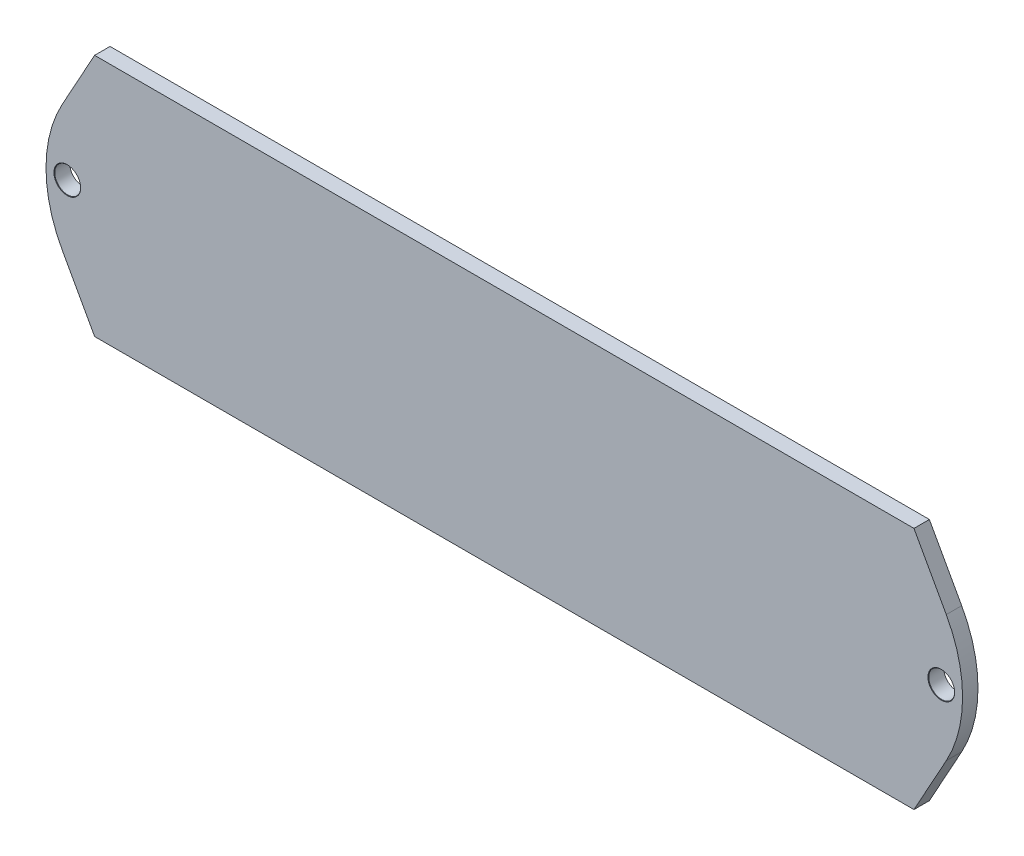
ISO-10303-21;
HEADER;
FILE_DESCRIPTION(('STEP AP214'),'2;1');
FILE_NAME('part.step','',(''),(''),'','','');
FILE_SCHEMA(('AUTOMOTIVE_DESIGN { 1 0 10303 214 1 1 1 1 }'));
ENDSEC;
DATA;
#1=APPLICATION_CONTEXT('core data for automotive mechanical design processes');
#2=APPLICATION_PROTOCOL_DEFINITION('international standard','automotive_design',2000,#1);
#3=PRODUCT_CONTEXT('',#1,'mechanical');
#4=PRODUCT('Part','Part','',(#3));
#5=PRODUCT_RELATED_PRODUCT_CATEGORY('part','',(#4));
#6=PRODUCT_DEFINITION_FORMATION('','',#4);
#7=PRODUCT_DEFINITION_CONTEXT('part definition',#1,'design');
#8=PRODUCT_DEFINITION('design','',#6,#7);
#9=PRODUCT_DEFINITION_SHAPE('','',#8);
#10=(LENGTH_UNIT() NAMED_UNIT(*) SI_UNIT(.MILLI.,.METRE.));
#11=(NAMED_UNIT(*) PLANE_ANGLE_UNIT() SI_UNIT($,.RADIAN.));
#12=(NAMED_UNIT(*) SI_UNIT($,.STERADIAN.) SOLID_ANGLE_UNIT());
#13=UNCERTAINTY_MEASURE_WITH_UNIT(LENGTH_MEASURE(1.E-05),#10,'distance_accuracy_value','');
#14=(GEOMETRIC_REPRESENTATION_CONTEXT(3) GLOBAL_UNCERTAINTY_ASSIGNED_CONTEXT((#13)) GLOBAL_UNIT_ASSIGNED_CONTEXT((#10,
#11,#12)) REPRESENTATION_CONTEXT('',''));
#15=CARTESIAN_POINT('',(0.,0.,0.));
#16=DIRECTION('',(0.,0.,1.));
#17=DIRECTION('',(1.,0.,0.));
#18=AXIS2_PLACEMENT_3D('',#15,#16,#17);
#19=CARTESIAN_POINT('',(-54.5903175982306,7.81349389640808,1.905));
#20=DIRECTION('',(0.875409582506593,-0.483381901663304,0.));
#21=DIRECTION('',(0.483381901663304,0.875409582506593,0.));
#22=AXIS2_PLACEMENT_3D('',#19,#20,#21);
#23=PLANE('',#22);
#24=DIRECTION('',(-0.483381901663304,-0.875409582506593,0.));
#25=VECTOR('',#24,1.);
#26=CARTESIAN_POINT('',(-54.5903175982306,7.81349389640808,0.));
#27=LINE('',#26,#25);
#28=CARTESIAN_POINT('',(-50.6,15.04,0.));
#29=VERTEX_POINT('',#28);
#30=CARTESIAN_POINT('',(-54.5903175982306,7.81349389640807,0.));
#31=VERTEX_POINT('',#30);
#32=EDGE_CURVE('E135',#29,#31,#27,.T.);
#33=ORIENTED_EDGE('',*,*,#32,.T.);
#34=DIRECTION('',(0.,0.,-1.));
#35=VECTOR('',#34,1.);
#36=CARTESIAN_POINT('',(-54.5903175982306,7.81349389640807,1.905));
#37=LINE('',#36,#35);
#38=CARTESIAN_POINT('',(-54.5903175982306,7.81349389640807,1.905));
#39=VERTEX_POINT('',#38);
#40=EDGE_CURVE('E11',#39,#31,#37,.T.);
#41=ORIENTED_EDGE('',*,*,#40,.F.);
#42=DIRECTION('',(-0.483381901663304,-0.875409582506593,0.));
#43=VECTOR('',#42,1.);
#44=CARTESIAN_POINT('',(-54.5903175982306,7.81349389640808,1.905));
#45=LINE('',#44,#43);
#46=CARTESIAN_POINT('',(-50.6,15.04,1.905));
#47=VERTEX_POINT('',#46);
#48=EDGE_CURVE('E150',#47,#39,#45,.T.);
#49=ORIENTED_EDGE('',*,*,#48,.F.);
#50=DIRECTION('',(0.,0.,-1.));
#51=VECTOR('',#50,1.);
#52=CARTESIAN_POINT('',(-50.6,15.04,1.905));
#53=LINE('',#52,#51);
#54=EDGE_CURVE('E131',#47,#29,#53,.T.);
#55=ORIENTED_EDGE('',*,*,#54,.T.);
#56=EDGE_LOOP('',(#33,#41,#49,#55));
#57=FACE_BOUND('',#56,.T.);
#58=ADVANCED_FACE('F39',(#57),#23,.F.);
#59=CARTESIAN_POINT('',(-40.44,0.,1.905));
#60=DIRECTION('',(0.,0.,-1.));
#61=DIRECTION('',(-1.,0.,0.));
#62=AXIS2_PLACEMENT_3D('',#59,#60,#61);
#63=CYLINDRICAL_SURFACE('',#62,16.1642251592831);
#64=CARTESIAN_POINT('',(-40.44,0.,0.));
#65=DIRECTION('',(0.,0.,1.));
#66=DIRECTION('',(-1.,0.,0.));
#67=AXIS2_PLACEMENT_3D('',#64,#65,#66);
#68=CIRCLE('',#67,16.1642251592831);
#69=CARTESIAN_POINT('',(-54.5903175982306,-7.81349389640805,0.));
#70=VERTEX_POINT('',#69);
#71=EDGE_CURVE('E138',#31,#70,#68,.T.);
#72=ORIENTED_EDGE('',*,*,#71,.T.);
#73=DIRECTION('',(0.,0.,-1.));
#74=VECTOR('',#73,1.);
#75=CARTESIAN_POINT('',(-54.5903175982306,-7.81349389640805,1.905));
#76=LINE('',#75,#74);
#77=CARTESIAN_POINT('',(-54.5903175982306,-7.81349389640805,1.905));
#78=VERTEX_POINT('',#77);
#79=EDGE_CURVE('E47',#78,#70,#76,.T.);
#80=ORIENTED_EDGE('',*,*,#79,.F.);
#81=CARTESIAN_POINT('',(-40.44,0.,1.905));
#82=DIRECTION('',(0.,0.,1.));
#83=DIRECTION('',(-1.,0.,0.));
#84=AXIS2_PLACEMENT_3D('',#81,#82,#83);
#85=CIRCLE('',#84,16.1642251592831);
#86=EDGE_CURVE('E98',#39,#78,#85,.T.);
#87=ORIENTED_EDGE('',*,*,#86,.F.);
#88=ORIENTED_EDGE('',*,*,#40,.T.);
#89=EDGE_LOOP('',(#72,#80,#87,#88));
#90=FACE_BOUND('',#89,.T.);
#91=ADVANCED_FACE('F225',(#90),#63,.T.);
#92=CARTESIAN_POINT('',(-50.6,-15.04,1.905));
#93=DIRECTION('',(0.875409582506593,0.483381901663304,0.));
#94=DIRECTION('',(-0.483381901663304,0.875409582506593,0.));
#95=AXIS2_PLACEMENT_3D('',#92,#93,#94);
#96=PLANE('',#95);
#97=DIRECTION('',(0.483381901663304,-0.875409582506593,0.));
#98=VECTOR('',#97,1.);
#99=CARTESIAN_POINT('',(-50.6,-15.04,0.));
#100=LINE('',#99,#98);
#101=CARTESIAN_POINT('',(-50.6,-15.04,0.));
#102=VERTEX_POINT('',#101);
#103=EDGE_CURVE('E141',#70,#102,#100,.T.);
#104=ORIENTED_EDGE('',*,*,#103,.T.);
#105=DIRECTION('',(0.,0.,-1.));
#106=VECTOR('',#105,1.);
#107=CARTESIAN_POINT('',(-50.6,-15.04,1.905));
#108=LINE('',#107,#106);
#109=CARTESIAN_POINT('',(-50.6,-15.04,1.905));
#110=VERTEX_POINT('',#109);
#111=EDGE_CURVE('E157',#110,#102,#108,.T.);
#112=ORIENTED_EDGE('',*,*,#111,.F.);
#113=DIRECTION('',(0.483381901663304,-0.875409582506593,0.));
#114=VECTOR('',#113,1.);
#115=CARTESIAN_POINT('',(-50.6,-15.04,1.905));
#116=LINE('',#115,#114);
#117=EDGE_CURVE('E165',#78,#110,#116,.T.);
#118=ORIENTED_EDGE('',*,*,#117,.F.);
#119=ORIENTED_EDGE('',*,*,#79,.T.);
#120=EDGE_LOOP('',(#104,#112,#118,#119));
#121=FACE_BOUND('',#120,.T.);
#122=ADVANCED_FACE('F163',(#121),#96,.F.);
#123=CARTESIAN_POINT('',(50.6,-15.04,1.905));
#124=DIRECTION('',(0.,1.,0.));
#125=DIRECTION('',(-1.,0.,0.));
#126=AXIS2_PLACEMENT_3D('',#123,#124,#125);
#127=PLANE('',#126);
#128=DIRECTION('',(1.,0.,0.));
#129=VECTOR('',#128,1.);
#130=CARTESIAN_POINT('',(50.6,-15.04,0.));
#131=LINE('',#130,#129);
#132=CARTESIAN_POINT('',(50.6,-15.04,0.));
#133=VERTEX_POINT('',#132);
#134=EDGE_CURVE('E143',#102,#133,#131,.T.);
#135=ORIENTED_EDGE('',*,*,#134,.T.);
#136=DIRECTION('',(0.,0.,-1.));
#137=VECTOR('',#136,1.);
#138=CARTESIAN_POINT('',(50.6,-15.04,1.905));
#139=LINE('',#138,#137);
#140=CARTESIAN_POINT('',(50.6,-15.04,1.905));
#141=VERTEX_POINT('',#140);
#142=EDGE_CURVE('E154',#141,#133,#139,.T.);
#143=ORIENTED_EDGE('',*,*,#142,.F.);
#144=DIRECTION('',(1.,0.,0.));
#145=VECTOR('',#144,1.);
#146=CARTESIAN_POINT('',(50.6,-15.04,1.905));
#147=LINE('',#146,#145);
#148=EDGE_CURVE('E177',#110,#141,#147,.T.);
#149=ORIENTED_EDGE('',*,*,#148,.F.);
#150=ORIENTED_EDGE('',*,*,#111,.T.);
#151=EDGE_LOOP('',(#135,#143,#149,#150));
#152=FACE_BOUND('',#151,.T.);
#153=ADVANCED_FACE('F173',(#152),#127,.F.);
#154=CARTESIAN_POINT('',(54.5903175982306,-7.81349389640805,1.905));
#155=DIRECTION('',(-0.875409582506594,0.483381901663302,0.));
#156=DIRECTION('',(-0.483381901663302,-0.875409582506594,0.));
#157=AXIS2_PLACEMENT_3D('',#154,#155,#156);
#158=PLANE('',#157);
#159=DIRECTION('',(0.483381901663302,0.875409582506594,0.));
#160=VECTOR('',#159,1.);
#161=CARTESIAN_POINT('',(54.5903175982306,-7.81349389640805,0.));
#162=LINE('',#161,#160);
#163=CARTESIAN_POINT('',(54.5903175982306,-7.81349389640805,0.));
#164=VERTEX_POINT('',#163);
#165=EDGE_CURVE('E145',#133,#164,#162,.T.);
#166=ORIENTED_EDGE('',*,*,#165,.T.);
#167=DIRECTION('',(0.,0.,-1.));
#168=VECTOR('',#167,1.);
#169=CARTESIAN_POINT('',(54.5903175982306,-7.81349389640805,1.905));
#170=LINE('',#169,#168);
#171=CARTESIAN_POINT('',(54.5903175982306,-7.81349389640805,1.905));
#172=VERTEX_POINT('',#171);
#173=EDGE_CURVE('E126',#172,#164,#170,.T.);
#174=ORIENTED_EDGE('',*,*,#173,.F.);
#175=DIRECTION('',(0.483381901663302,0.875409582506594,0.));
#176=VECTOR('',#175,1.);
#177=CARTESIAN_POINT('',(54.5903175982306,-7.81349389640805,1.905));
#178=LINE('',#177,#176);
#179=EDGE_CURVE('E117',#141,#172,#178,.T.);
#180=ORIENTED_EDGE('',*,*,#179,.F.);
#181=ORIENTED_EDGE('',*,*,#142,.T.);
#182=EDGE_LOOP('',(#166,#174,#180,#181));
#183=FACE_BOUND('',#182,.T.);
#184=ADVANCED_FACE('F176',(#183),#158,.F.);
#185=CARTESIAN_POINT('',(40.44,0.,1.905));
#186=DIRECTION('',(0.,0.,-1.));
#187=DIRECTION('',(-1.,0.,0.));
#188=AXIS2_PLACEMENT_3D('',#185,#186,#187);
#189=CYLINDRICAL_SURFACE('',#188,16.1642251592831);
#190=CARTESIAN_POINT('',(40.44,0.,0.));
#191=DIRECTION('',(0.,0.,1.));
#192=DIRECTION('',(-1.,0.,0.));
#193=AXIS2_PLACEMENT_3D('',#190,#191,#192);
#194=CIRCLE('',#193,16.1642251592831);
#195=CARTESIAN_POINT('',(54.5903175982306,7.81349389640807,0.));
#196=VERTEX_POINT('',#195);
#197=EDGE_CURVE('E125',#164,#196,#194,.T.);
#198=ORIENTED_EDGE('',*,*,#197,.T.);
#199=DIRECTION('',(0.,0.,-1.));
#200=VECTOR('',#199,1.);
#201=CARTESIAN_POINT('',(54.5903175982306,7.81349389640807,1.905));
#202=LINE('',#201,#200);
#203=CARTESIAN_POINT('',(54.5903175982306,7.81349389640807,1.905));
#204=VERTEX_POINT('',#203);
#205=EDGE_CURVE('E122',#204,#196,#202,.T.);
#206=ORIENTED_EDGE('',*,*,#205,.F.);
#207=CARTESIAN_POINT('',(40.44,0.,1.905));
#208=DIRECTION('',(0.,0.,1.));
#209=DIRECTION('',(-1.,0.,0.));
#210=AXIS2_PLACEMENT_3D('',#207,#208,#209);
#211=CIRCLE('',#210,16.1642251592831);
#212=EDGE_CURVE('E111',#172,#204,#211,.T.);
#213=ORIENTED_EDGE('',*,*,#212,.F.);
#214=ORIENTED_EDGE('',*,*,#173,.T.);
#215=EDGE_LOOP('',(#198,#206,#213,#214));
#216=FACE_BOUND('',#215,.T.);
#217=ADVANCED_FACE('F123',(#216),#189,.T.);
#218=CARTESIAN_POINT('',(50.6,15.04,1.905));
#219=DIRECTION('',(-0.875409582506594,-0.483381901663303,0.));
#220=DIRECTION('',(0.483381901663303,-0.875409582506594,0.));
#221=AXIS2_PLACEMENT_3D('',#218,#219,#220);
#222=PLANE('',#221);
#223=DIRECTION('',(-0.483381901663303,0.875409582506594,0.));
#224=VECTOR('',#223,1.);
#225=CARTESIAN_POINT('',(50.6,15.04,0.));
#226=LINE('',#225,#224);
#227=CARTESIAN_POINT('',(50.6,15.04,0.));
#228=VERTEX_POINT('',#227);
#229=EDGE_CURVE('E84',#196,#228,#226,.T.);
#230=ORIENTED_EDGE('',*,*,#229,.T.);
#231=DIRECTION('',(0.,0.,-1.));
#232=VECTOR('',#231,1.);
#233=CARTESIAN_POINT('',(50.6,15.04,1.905));
#234=LINE('',#233,#232);
#235=CARTESIAN_POINT('',(50.6,15.04,1.905));
#236=VERTEX_POINT('',#235);
#237=EDGE_CURVE('E127',#236,#228,#234,.T.);
#238=ORIENTED_EDGE('',*,*,#237,.F.);
#239=DIRECTION('',(-0.483381901663303,0.875409582506594,0.));
#240=VECTOR('',#239,1.);
#241=CARTESIAN_POINT('',(50.6,15.04,1.905));
#242=LINE('',#241,#240);
#243=EDGE_CURVE('E115',#204,#236,#242,.T.);
#244=ORIENTED_EDGE('',*,*,#243,.F.);
#245=ORIENTED_EDGE('',*,*,#205,.T.);
#246=EDGE_LOOP('',(#230,#238,#244,#245));
#247=FACE_BOUND('',#246,.T.);
#248=ADVANCED_FACE('F129',(#247),#222,.F.);
#249=CARTESIAN_POINT('',(-50.6,15.04,1.905));
#250=DIRECTION('',(0.,-1.,0.));
#251=DIRECTION('',(0.,0.,-1.));
#252=AXIS2_PLACEMENT_3D('',#249,#250,#251);
#253=PLANE('',#252);
#254=DIRECTION('',(-1.,0.,0.));
#255=VECTOR('',#254,1.);
#256=CARTESIAN_POINT('',(-50.6,15.04,0.));
#257=LINE('',#256,#255);
#258=EDGE_CURVE('E90',#228,#29,#257,.T.);
#259=ORIENTED_EDGE('',*,*,#258,.T.);
#260=ORIENTED_EDGE('',*,*,#54,.F.);
#261=DIRECTION('',(-1.,0.,0.));
#262=VECTOR('',#261,1.);
#263=CARTESIAN_POINT('',(-50.6,15.04,1.905));
#264=LINE('',#263,#262);
#265=EDGE_CURVE('E55',#236,#47,#264,.T.);
#266=ORIENTED_EDGE('',*,*,#265,.F.);
#267=ORIENTED_EDGE('',*,*,#237,.T.);
#268=EDGE_LOOP('',(#259,#260,#266,#267));
#269=FACE_BOUND('',#268,.T.);
#270=ADVANCED_FACE('F205',(#269),#253,.F.);
#271=CARTESIAN_POINT('',(40.44,0.,1.905));
#272=DIRECTION('',(0.,0.,-1.));
#273=DIRECTION('',(-1.,0.,0.));
#274=AXIS2_PLACEMENT_3D('',#271,#272,#273);
#275=PLANE('',#274);
#276=CARTESIAN_POINT('',(-53.975,0.,1.905));
#277=DIRECTION('',(0.,0.,1.));
#278=DIRECTION('',(1.,0.,0.));
#279=AXIS2_PLACEMENT_3D('',#276,#277,#278);
#280=CIRCLE('',#279,1.65);
#281=CARTESIAN_POINT('',(-52.325,0.,1.905));
#282=VERTEX_POINT('',#281);
#283=EDGE_CURVE('E197',#282,#282,#280,.T.);
#284=ORIENTED_EDGE('',*,*,#283,.F.);
#285=EDGE_LOOP('',(#284));
#286=FACE_BOUND('',#285,.T.);
#287=CARTESIAN_POINT('',(53.975,0.,1.905));
#288=DIRECTION('',(0.,0.,1.));
#289=DIRECTION('',(1.,0.,0.));
#290=AXIS2_PLACEMENT_3D('',#287,#288,#289);
#291=CIRCLE('',#290,1.65);
#292=CARTESIAN_POINT('',(55.625,0.,1.905));
#293=VERTEX_POINT('',#292);
#294=EDGE_CURVE('E188',#293,#293,#291,.T.);
#295=ORIENTED_EDGE('',*,*,#294,.F.);
#296=EDGE_LOOP('',(#295));
#297=FACE_BOUND('',#296,.T.);
#298=ORIENTED_EDGE('',*,*,#48,.T.);
#299=ORIENTED_EDGE('',*,*,#86,.T.);
#300=ORIENTED_EDGE('',*,*,#117,.T.);
#301=ORIENTED_EDGE('',*,*,#148,.T.);
#302=ORIENTED_EDGE('',*,*,#179,.T.);
#303=ORIENTED_EDGE('',*,*,#212,.T.);
#304=ORIENTED_EDGE('',*,*,#243,.T.);
#305=ORIENTED_EDGE('',*,*,#265,.T.);
#306=EDGE_LOOP('',(#298,#299,#300,#301,#302,#303,#304,#305));
#307=FACE_BOUND('',#306,.T.);
#308=ADVANCED_FACE('F113',(#286,#297,#307),#275,.F.);
#309=CARTESIAN_POINT('',(40.44,0.,0.));
#310=DIRECTION('',(0.,0.,-1.));
#311=DIRECTION('',(-1.,0.,0.));
#312=AXIS2_PLACEMENT_3D('',#309,#310,#311);
#313=PLANE('',#312);
#314=CARTESIAN_POINT('',(-53.975,0.,0.));
#315=DIRECTION('',(0.,0.,1.));
#316=DIRECTION('',(1.,0.,0.));
#317=AXIS2_PLACEMENT_3D('',#314,#315,#316);
#318=CIRCLE('',#317,1.6);
#319=CARTESIAN_POINT('',(-52.375,0.,0.));
#320=VERTEX_POINT('',#319);
#321=EDGE_CURVE('E191',#320,#320,#318,.T.);
#322=ORIENTED_EDGE('',*,*,#321,.T.);
#323=EDGE_LOOP('',(#322));
#324=FACE_BOUND('',#323,.T.);
#325=CARTESIAN_POINT('',(53.975,0.,0.));
#326=DIRECTION('',(0.,0.,1.));
#327=DIRECTION('',(1.,0.,0.));
#328=AXIS2_PLACEMENT_3D('',#325,#326,#327);
#329=CIRCLE('',#328,1.6);
#330=CARTESIAN_POINT('',(55.575,0.,0.));
#331=VERTEX_POINT('',#330);
#332=EDGE_CURVE('E139',#331,#331,#329,.T.);
#333=ORIENTED_EDGE('',*,*,#332,.T.);
#334=EDGE_LOOP('',(#333));
#335=FACE_BOUND('',#334,.T.);
#336=ORIENTED_EDGE('',*,*,#32,.F.);
#337=ORIENTED_EDGE('',*,*,#258,.F.);
#338=ORIENTED_EDGE('',*,*,#229,.F.);
#339=ORIENTED_EDGE('',*,*,#197,.F.);
#340=ORIENTED_EDGE('',*,*,#165,.F.);
#341=ORIENTED_EDGE('',*,*,#134,.F.);
#342=ORIENTED_EDGE('',*,*,#103,.F.);
#343=ORIENTED_EDGE('',*,*,#71,.F.);
#344=EDGE_LOOP('',(#336,#337,#338,#339,#340,#341,#342,#343));
#345=FACE_BOUND('',#344,.T.);
#346=ADVANCED_FACE('F169',(#324,#335,#345),#313,.T.);
#347=CARTESIAN_POINT('',(53.975,0.,1.905));
#348=DIRECTION('',(0.,0.,1.));
#349=DIRECTION('',(1.,0.,0.));
#350=AXIS2_PLACEMENT_3D('',#347,#348,#349);
#351=CYLINDRICAL_SURFACE('',#350,1.6);
#352=ORIENTED_EDGE('',*,*,#332,.F.);
#353=EDGE_LOOP('',(#352));
#354=FACE_BOUND('',#353,.T.);
#355=CARTESIAN_POINT('',(53.975,0.,1.855));
#356=DIRECTION('',(0.,0.,1.));
#357=DIRECTION('',(1.,0.,0.));
#358=AXIS2_PLACEMENT_3D('',#355,#356,#357);
#359=CIRCLE('',#358,1.6);
#360=CARTESIAN_POINT('',(55.575,0.,1.855));
#361=VERTEX_POINT('',#360);
#362=EDGE_CURVE('E185',#361,#361,#359,.T.);
#363=ORIENTED_EDGE('',*,*,#362,.T.);
#364=EDGE_LOOP('',(#363));
#365=FACE_BOUND('',#364,.T.);
#366=ADVANCED_FACE('F212',(#354,#365),#351,.F.);
#367=CARTESIAN_POINT('',(53.975,0.,1.905));
#368=DIRECTION('',(0.,0.,1.));
#369=DIRECTION('',(1.,0.,0.));
#370=AXIS2_PLACEMENT_3D('',#367,#368,#369);
#371=CONICAL_SURFACE('',#370,1.65,0.785398163397463);
#372=ORIENTED_EDGE('',*,*,#362,.F.);
#373=EDGE_LOOP('',(#372));
#374=FACE_BOUND('',#373,.T.);
#375=ORIENTED_EDGE('',*,*,#294,.T.);
#376=EDGE_LOOP('',(#375));
#377=FACE_BOUND('',#376,.T.);
#378=ADVANCED_FACE('F209',(#374,#377),#371,.F.);
#379=CARTESIAN_POINT('',(-53.975,0.,1.905));
#380=DIRECTION('',(0.,0.,1.));
#381=DIRECTION('',(1.,0.,0.));
#382=AXIS2_PLACEMENT_3D('',#379,#380,#381);
#383=CYLINDRICAL_SURFACE('',#382,1.6);
#384=ORIENTED_EDGE('',*,*,#321,.F.);
#385=EDGE_LOOP('',(#384));
#386=FACE_BOUND('',#385,.T.);
#387=CARTESIAN_POINT('',(-53.975,0.,1.855));
#388=DIRECTION('',(0.,0.,1.));
#389=DIRECTION('',(1.,0.,0.));
#390=AXIS2_PLACEMENT_3D('',#387,#388,#389);
#391=CIRCLE('',#390,1.6);
#392=CARTESIAN_POINT('',(-52.375,0.,1.855));
#393=VERTEX_POINT('',#392);
#394=EDGE_CURVE('E194',#393,#393,#391,.T.);
#395=ORIENTED_EDGE('',*,*,#394,.T.);
#396=EDGE_LOOP('',(#395));
#397=FACE_BOUND('',#396,.T.);
#398=ADVANCED_FACE('F211',(#386,#397),#383,.F.);
#399=CARTESIAN_POINT('',(-53.975,0.,1.905));
#400=DIRECTION('',(0.,0.,1.));
#401=DIRECTION('',(1.,0.,0.));
#402=AXIS2_PLACEMENT_3D('',#399,#400,#401);
#403=CONICAL_SURFACE('',#402,1.65,0.785398163397463);
#404=ORIENTED_EDGE('',*,*,#394,.F.);
#405=EDGE_LOOP('',(#404));
#406=FACE_BOUND('',#405,.T.);
#407=ORIENTED_EDGE('',*,*,#283,.T.);
#408=EDGE_LOOP('',(#407));
#409=FACE_BOUND('',#408,.T.);
#410=ADVANCED_FACE('F201',(#406,#409),#403,.F.);
#411=CLOSED_SHELL('',(#58,#91,#122,#153,#184,#217,#248,#270,#308,#346,#366,#378,#398,#410));
#412=MANIFOLD_SOLID_BREP('B2',#411);
#413=ADVANCED_BREP_SHAPE_REPRESENTATION('',(#18,#412),#14);
#414=SHAPE_DEFINITION_REPRESENTATION(#9,#413);
ENDSEC;
END-ISO-10303-21;
